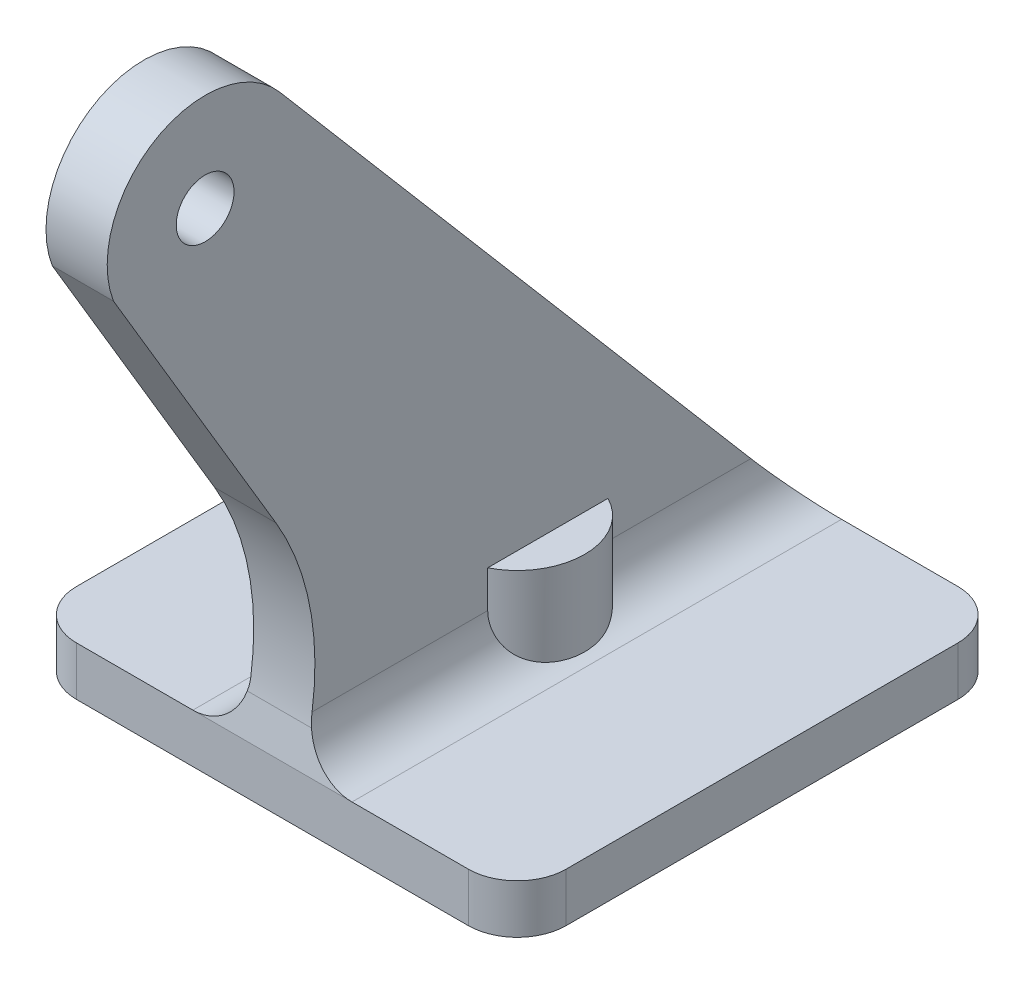
ISO-10303-21;
HEADER;
FILE_DESCRIPTION(('STEP AP214'),'2;1');
FILE_NAME('part.step','',(''),(''),'','','');
FILE_SCHEMA(('AUTOMOTIVE_DESIGN { 1 0 10303 214 1 1 1 1 }'));
ENDSEC;
DATA;
#1=APPLICATION_CONTEXT('core data for automotive mechanical design processes');
#2=APPLICATION_PROTOCOL_DEFINITION('international standard','automotive_design',2000,#1);
#3=PRODUCT_CONTEXT('',#1,'mechanical');
#4=PRODUCT('Part','Part','',(#3));
#5=PRODUCT_RELATED_PRODUCT_CATEGORY('part','',(#4));
#6=PRODUCT_DEFINITION_FORMATION('','',#4);
#7=PRODUCT_DEFINITION_CONTEXT('part definition',#1,'design');
#8=PRODUCT_DEFINITION('design','',#6,#7);
#9=PRODUCT_DEFINITION_SHAPE('','',#8);
#10=(LENGTH_UNIT() NAMED_UNIT(*) SI_UNIT(.MILLI.,.METRE.));
#11=(NAMED_UNIT(*) PLANE_ANGLE_UNIT() SI_UNIT($,.RADIAN.));
#12=(NAMED_UNIT(*) SI_UNIT($,.STERADIAN.) SOLID_ANGLE_UNIT());
#13=UNCERTAINTY_MEASURE_WITH_UNIT(LENGTH_MEASURE(1.E-05),#10,'distance_accuracy_value','');
#14=(GEOMETRIC_REPRESENTATION_CONTEXT(3) GLOBAL_UNCERTAINTY_ASSIGNED_CONTEXT((#13)) GLOBAL_UNIT_ASSIGNED_CONTEXT((#10,
#11,#12)) REPRESENTATION_CONTEXT('',''));
#15=CARTESIAN_POINT('',(0.,0.,0.));
#16=DIRECTION('',(0.,0.,1.));
#17=DIRECTION('',(1.,0.,0.));
#18=AXIS2_PLACEMENT_3D('',#15,#16,#17);
#19=CARTESIAN_POINT('',(0.,2.54,0.));
#20=DIRECTION('',(0.,1.,0.));
#21=DIRECTION('',(0.,0.,1.));
#22=AXIS2_PLACEMENT_3D('',#19,#20,#21);
#23=PLANE('',#22);
#24=DIRECTION('',(0.,0.,1.));
#25=VECTOR('',#24,1.);
#26=CARTESIAN_POINT('',(-12.7,2.54,-12.7));
#27=LINE('',#26,#25);
#28=CARTESIAN_POINT('',(-12.7,2.54,-10.16));
#29=VERTEX_POINT('',#28);
#30=CARTESIAN_POINT('',(-12.7,2.54,10.16));
#31=VERTEX_POINT('',#30);
#32=EDGE_CURVE('E233',#29,#31,#27,.T.);
#33=ORIENTED_EDGE('',*,*,#32,.T.);
#34=CARTESIAN_POINT('',(-10.16,2.54,10.16));
#35=DIRECTION('',(0.,1.,0.));
#36=DIRECTION('',(0.,0.,1.));
#37=AXIS2_PLACEMENT_3D('',#34,#35,#36);
#38=CIRCLE('',#37,2.54);
#39=CARTESIAN_POINT('',(-10.16,2.54,12.7));
#40=VERTEX_POINT('',#39);
#41=EDGE_CURVE('E338',#31,#40,#38,.T.);
#42=ORIENTED_EDGE('',*,*,#41,.T.);
#43=DIRECTION('',(1.,0.,0.));
#44=VECTOR('',#43,1.);
#45=CARTESIAN_POINT('',(-12.7,2.54,12.7));
#46=LINE('',#45,#44);
#47=CARTESIAN_POINT('',(-4.1275,2.54,12.7));
#48=VERTEX_POINT('',#47);
#49=EDGE_CURVE('E273',#40,#48,#46,.T.);
#50=ORIENTED_EDGE('',*,*,#49,.T.);
#51=DIRECTION('',(0.,0.,-1.));
#52=VECTOR('',#51,1.);
#53=CARTESIAN_POINT('',(-4.1275,2.54,-12.7));
#54=LINE('',#53,#52);
#55=CARTESIAN_POINT('',(-4.1275,2.54,-12.7));
#56=VERTEX_POINT('',#55);
#57=EDGE_CURVE('E275',#48,#56,#54,.T.);
#58=ORIENTED_EDGE('',*,*,#57,.T.);
#59=DIRECTION('',(-1.,0.,0.));
#60=VECTOR('',#59,1.);
#61=CARTESIAN_POINT('',(-12.7,2.54,-12.7));
#62=LINE('',#61,#60);
#63=CARTESIAN_POINT('',(-10.16,2.54,-12.7));
#64=VERTEX_POINT('',#63);
#65=EDGE_CURVE('E229',#56,#64,#62,.T.);
#66=ORIENTED_EDGE('',*,*,#65,.T.);
#67=CARTESIAN_POINT('',(-10.16,2.54,-10.16));
#68=DIRECTION('',(0.,1.,0.));
#69=DIRECTION('',(0.,0.,1.));
#70=AXIS2_PLACEMENT_3D('',#67,#68,#69);
#71=CIRCLE('',#70,2.54);
#72=EDGE_CURVE('E340',#64,#29,#71,.T.);
#73=ORIENTED_EDGE('',*,*,#72,.T.);
#74=EDGE_LOOP('',(#33,#42,#50,#58,#66,#73));
#75=FACE_BOUND('',#74,.T.);
#76=ADVANCED_FACE('F33',(#75),#23,.T.);
#77=CARTESIAN_POINT('',(12.7,2.54,-12.7));
#78=DIRECTION('',(-1.,0.,0.));
#79=DIRECTION('',(0.,0.,1.));
#80=AXIS2_PLACEMENT_3D('',#77,#78,#79);
#81=PLANE('',#80);
#82=DIRECTION('',(0.,0.,-1.));
#83=VECTOR('',#82,1.);
#84=CARTESIAN_POINT('',(12.7,0.,-12.7));
#85=LINE('',#84,#83);
#86=CARTESIAN_POINT('',(12.7,0.,10.16));
#87=VERTEX_POINT('',#86);
#88=CARTESIAN_POINT('',(12.7,0.,-10.16));
#89=VERTEX_POINT('',#88);
#90=EDGE_CURVE('E280',#87,#89,#85,.T.);
#91=ORIENTED_EDGE('',*,*,#90,.T.);
#92=DIRECTION('',(0.,-1.,0.));
#93=VECTOR('',#92,1.);
#94=CARTESIAN_POINT('',(12.7,2.54,-10.16));
#95=LINE('',#94,#93);
#96=CARTESIAN_POINT('',(12.7,2.54,-10.16));
#97=VERTEX_POINT('',#96);
#98=EDGE_CURVE('E266',#89,#97,#95,.F.);
#99=ORIENTED_EDGE('',*,*,#98,.T.);
#100=DIRECTION('',(0.,0.,-1.));
#101=VECTOR('',#100,1.);
#102=CARTESIAN_POINT('',(12.7,2.54,-12.7));
#103=LINE('',#102,#101);
#104=CARTESIAN_POINT('',(12.7,2.54,10.16));
#105=VERTEX_POINT('',#104);
#106=EDGE_CURVE('E226',#105,#97,#103,.T.);
#107=ORIENTED_EDGE('',*,*,#106,.F.);
#108=DIRECTION('',(0.,-1.,0.));
#109=VECTOR('',#108,1.);
#110=CARTESIAN_POINT('',(12.7,2.54,10.16));
#111=LINE('',#110,#109);
#112=EDGE_CURVE('E263',#105,#87,#111,.T.);
#113=ORIENTED_EDGE('',*,*,#112,.T.);
#114=EDGE_LOOP('',(#91,#99,#107,#113));
#115=FACE_BOUND('',#114,.T.);
#116=ADVANCED_FACE('F314',(#115),#81,.F.);
#117=CARTESIAN_POINT('',(-12.7,2.54,-12.7));
#118=DIRECTION('',(0.,0.,1.));
#119=DIRECTION('',(1.,0.,0.));
#120=AXIS2_PLACEMENT_3D('',#117,#118,#119);
#121=PLANE('',#120);
#122=CARTESIAN_POINT('',(10.16,2.54,-12.7));
#123=VERTEX_POINT('',#122);
#124=CARTESIAN_POINT('',(4.1275,2.54,-12.7));
#125=VERTEX_POINT('',#124);
#126=EDGE_CURVE('E240',#123,#125,#62,.T.);
#127=ORIENTED_EDGE('',*,*,#126,.F.);
#128=DIRECTION('',(0.,-1.,0.));
#129=VECTOR('',#128,1.);
#130=CARTESIAN_POINT('',(10.16,2.54,-12.7));
#131=LINE('',#130,#129);
#132=CARTESIAN_POINT('',(10.16,0.,-12.7));
#133=VERTEX_POINT('',#132);
#134=EDGE_CURVE('E252',#123,#133,#131,.T.);
#135=ORIENTED_EDGE('',*,*,#134,.T.);
#136=DIRECTION('',(-1.,0.,0.));
#137=VECTOR('',#136,1.);
#138=CARTESIAN_POINT('',(-12.7,0.,-12.7));
#139=LINE('',#138,#137);
#140=CARTESIAN_POINT('',(-10.16,0.,-12.7));
#141=VERTEX_POINT('',#140);
#142=EDGE_CURVE('E367',#133,#141,#139,.T.);
#143=ORIENTED_EDGE('',*,*,#142,.T.);
#144=DIRECTION('',(0.,-1.,0.));
#145=VECTOR('',#144,1.);
#146=CARTESIAN_POINT('',(-10.16,2.54,-12.7));
#147=LINE('',#146,#145);
#148=EDGE_CURVE('E250',#141,#64,#147,.F.);
#149=ORIENTED_EDGE('',*,*,#148,.T.);
#150=ORIENTED_EDGE('',*,*,#65,.F.);
#151=DIRECTION('',(-1.,0.,0.));
#152=VECTOR('',#151,1.);
#153=CARTESIAN_POINT('',(1.5875,2.54,-12.7));
#154=LINE('',#153,#152);
#155=EDGE_CURVE('E225',#125,#56,#154,.T.);
#156=ORIENTED_EDGE('',*,*,#155,.F.);
#157=EDGE_LOOP('',(#127,#135,#143,#149,#150,#156));
#158=FACE_BOUND('',#157,.T.);
#159=ADVANCED_FACE('F457',(#158),#121,.F.);
#160=CARTESIAN_POINT('',(-12.7,2.54,-12.7));
#161=DIRECTION('',(1.,0.,0.));
#162=DIRECTION('',(0.,0.,-1.));
#163=AXIS2_PLACEMENT_3D('',#160,#161,#162);
#164=PLANE('',#163);
#165=DIRECTION('',(0.,0.,1.));
#166=VECTOR('',#165,1.);
#167=CARTESIAN_POINT('',(-12.7,0.,-12.7));
#168=LINE('',#167,#166);
#169=CARTESIAN_POINT('',(-12.7,0.,-10.16));
#170=VERTEX_POINT('',#169);
#171=CARTESIAN_POINT('',(-12.7,0.,10.16));
#172=VERTEX_POINT('',#171);
#173=EDGE_CURVE('E365',#170,#172,#168,.T.);
#174=ORIENTED_EDGE('',*,*,#173,.T.);
#175=DIRECTION('',(0.,-1.,0.));
#176=VECTOR('',#175,1.);
#177=CARTESIAN_POINT('',(-12.7,2.54,10.16));
#178=LINE('',#177,#176);
#179=EDGE_CURVE('E342',#172,#31,#178,.F.);
#180=ORIENTED_EDGE('',*,*,#179,.T.);
#181=ORIENTED_EDGE('',*,*,#32,.F.);
#182=DIRECTION('',(0.,-1.,0.));
#183=VECTOR('',#182,1.);
#184=CARTESIAN_POINT('',(-12.7,2.54,-10.16));
#185=LINE('',#184,#183);
#186=EDGE_CURVE('E344',#29,#170,#185,.T.);
#187=ORIENTED_EDGE('',*,*,#186,.T.);
#188=EDGE_LOOP('',(#174,#180,#181,#187));
#189=FACE_BOUND('',#188,.T.);
#190=ADVANCED_FACE('F581',(#189),#164,.F.);
#191=CARTESIAN_POINT('',(-12.7,2.54,12.7));
#192=DIRECTION('',(0.,0.,-1.));
#193=DIRECTION('',(-1.,0.,0.));
#194=AXIS2_PLACEMENT_3D('',#191,#192,#193);
#195=PLANE('',#194);
#196=DIRECTION('',(1.,0.,0.));
#197=VECTOR('',#196,1.);
#198=CARTESIAN_POINT('',(-12.7,0.,12.7));
#199=LINE('',#198,#197);
#200=CARTESIAN_POINT('',(-10.16,0.,12.7));
#201=VERTEX_POINT('',#200);
#202=CARTESIAN_POINT('',(10.16,0.,12.7));
#203=VERTEX_POINT('',#202);
#204=EDGE_CURVE('E230',#201,#203,#199,.T.);
#205=ORIENTED_EDGE('',*,*,#204,.T.);
#206=DIRECTION('',(0.,-1.,0.));
#207=VECTOR('',#206,1.);
#208=CARTESIAN_POINT('',(10.16,2.54,12.7));
#209=LINE('',#208,#207);
#210=CARTESIAN_POINT('',(10.16,2.54,12.7));
#211=VERTEX_POINT('',#210);
#212=EDGE_CURVE('E346',#203,#211,#209,.F.);
#213=ORIENTED_EDGE('',*,*,#212,.T.);
#214=CARTESIAN_POINT('',(4.1275,2.54,12.7));
#215=VERTEX_POINT('',#214);
#216=EDGE_CURVE('E276',#215,#211,#46,.T.);
#217=ORIENTED_EDGE('',*,*,#216,.F.);
#218=DIRECTION('',(-1.,0.,0.));
#219=VECTOR('',#218,1.);
#220=CARTESIAN_POINT('',(1.5875,2.54,12.7));
#221=LINE('',#220,#219);
#222=EDGE_CURVE('E371',#215,#48,#221,.T.);
#223=ORIENTED_EDGE('',*,*,#222,.T.);
#224=ORIENTED_EDGE('',*,*,#49,.F.);
#225=DIRECTION('',(0.,-1.,0.));
#226=VECTOR('',#225,1.);
#227=CARTESIAN_POINT('',(-10.16,2.54,12.7));
#228=LINE('',#227,#226);
#229=EDGE_CURVE('E272',#40,#201,#228,.T.);
#230=ORIENTED_EDGE('',*,*,#229,.T.);
#231=EDGE_LOOP('',(#205,#213,#217,#223,#224,#230));
#232=FACE_BOUND('',#231,.T.);
#233=ADVANCED_FACE('F355',(#232),#195,.F.);
#234=ORIENTED_EDGE('',*,*,#106,.T.);
#235=CARTESIAN_POINT('',(10.16,2.54,-10.16));
#236=DIRECTION('',(0.,1.,0.));
#237=DIRECTION('',(0.,0.,1.));
#238=AXIS2_PLACEMENT_3D('',#235,#236,#237);
#239=CIRCLE('',#238,2.54);
#240=EDGE_CURVE('E270',#97,#123,#239,.T.);
#241=ORIENTED_EDGE('',*,*,#240,.T.);
#242=ORIENTED_EDGE('',*,*,#126,.T.);
#243=DIRECTION('',(0.,0.,-1.));
#244=VECTOR('',#243,1.);
#245=CARTESIAN_POINT('',(4.1275,2.54,0.));
#246=LINE('',#245,#244);
#247=EDGE_CURVE('E289',#125,#215,#246,.F.);
#248=ORIENTED_EDGE('',*,*,#247,.T.);
#249=ORIENTED_EDGE('',*,*,#216,.T.);
#250=CARTESIAN_POINT('',(10.16,2.54,10.16));
#251=DIRECTION('',(0.,1.,0.));
#252=DIRECTION('',(0.,0.,1.));
#253=AXIS2_PLACEMENT_3D('',#250,#251,#252);
#254=CIRCLE('',#253,2.54);
#255=EDGE_CURVE('E268',#211,#105,#254,.T.);
#256=ORIENTED_EDGE('',*,*,#255,.T.);
#257=EDGE_LOOP('',(#234,#241,#242,#248,#249,#256));
#258=FACE_BOUND('',#257,.T.);
#259=ADVANCED_FACE('F442',(#258),#23,.T.);
#260=CARTESIAN_POINT('',(0.,0.,0.));
#261=DIRECTION('',(0.,1.,0.));
#262=DIRECTION('',(0.,0.,1.));
#263=AXIS2_PLACEMENT_3D('',#260,#261,#262);
#264=PLANE('',#263);
#265=CARTESIAN_POINT('',(0.,0.,0.));
#266=DIRECTION('',(0.,-1.,0.));
#267=DIRECTION('',(0.,0.,-1.));
#268=AXIS2_PLACEMENT_3D('',#265,#266,#267);
#269=CIRCLE('',#268,1.25);
#270=CARTESIAN_POINT('',(0.,0.,-1.25));
#271=VERTEX_POINT('',#270);
#272=EDGE_CURVE('E433',#271,#271,#269,.T.);
#273=ORIENTED_EDGE('',*,*,#272,.F.);
#274=EDGE_LOOP('',(#273));
#275=FACE_BOUND('',#274,.T.);
#276=ORIENTED_EDGE('',*,*,#142,.F.);
#277=CARTESIAN_POINT('',(10.16,0.,-10.16));
#278=DIRECTION('',(0.,1.,0.));
#279=DIRECTION('',(0.,0.,1.));
#280=AXIS2_PLACEMENT_3D('',#277,#278,#279);
#281=CIRCLE('',#280,2.54);
#282=EDGE_CURVE('E261',#133,#89,#281,.F.);
#283=ORIENTED_EDGE('',*,*,#282,.T.);
#284=ORIENTED_EDGE('',*,*,#90,.F.);
#285=CARTESIAN_POINT('',(10.16,0.,10.16));
#286=DIRECTION('',(0.,1.,0.));
#287=DIRECTION('',(0.,0.,1.));
#288=AXIS2_PLACEMENT_3D('',#285,#286,#287);
#289=CIRCLE('',#288,2.54);
#290=EDGE_CURVE('E259',#87,#203,#289,.F.);
#291=ORIENTED_EDGE('',*,*,#290,.T.);
#292=ORIENTED_EDGE('',*,*,#204,.F.);
#293=CARTESIAN_POINT('',(-10.16,0.,10.16));
#294=DIRECTION('',(0.,1.,0.));
#295=DIRECTION('',(0.,0.,1.));
#296=AXIS2_PLACEMENT_3D('',#293,#294,#295);
#297=CIRCLE('',#296,2.54);
#298=EDGE_CURVE('E257',#201,#172,#297,.F.);
#299=ORIENTED_EDGE('',*,*,#298,.T.);
#300=ORIENTED_EDGE('',*,*,#173,.F.);
#301=CARTESIAN_POINT('',(-10.16,0.,-10.16));
#302=DIRECTION('',(0.,1.,0.));
#303=DIRECTION('',(0.,0.,1.));
#304=AXIS2_PLACEMENT_3D('',#301,#302,#303);
#305=CIRCLE('',#304,2.54);
#306=EDGE_CURVE('E255',#170,#141,#305,.F.);
#307=ORIENTED_EDGE('',*,*,#306,.T.);
#308=EDGE_LOOP('',(#276,#283,#284,#291,#292,#299,#300,#307));
#309=FACE_BOUND('',#308,.T.);
#310=ADVANCED_FACE('F361',(#275,#309),#264,.F.);
#311=CARTESIAN_POINT('',(1.5875,30.48,17.78));
#312=DIRECTION('',(-1.,0.,0.));
#313=DIRECTION('',(0.,0.,1.));
#314=AXIS2_PLACEMENT_3D('',#311,#312,#313);
#315=PLANE('',#314);
#316=DIRECTION('',(0.,0.,1.));
#317=VECTOR('',#316,1.);
#318=CARTESIAN_POINT('',(1.5875,7.,17.78));
#319=LINE('',#318,#317);
#320=CARTESIAN_POINT('',(1.5875,7.,-3.11926974627075));
#321=VERTEX_POINT('',#320);
#322=CARTESIAN_POINT('',(1.5875,7.,3.11926974627075));
#323=VERTEX_POINT('',#322);
#324=EDGE_CURVE('E181',#321,#323,#319,.T.);
#325=ORIENTED_EDGE('',*,*,#324,.F.);
#326=DIRECTION('',(0.,-1.,0.));
#327=VECTOR('',#326,1.);
#328=CARTESIAN_POINT('',(1.5875,7.,-3.11926974627075));
#329=LINE('',#328,#327);
#330=CARTESIAN_POINT('',(1.5875,5.08,-3.11926974627075));
#331=VERTEX_POINT('',#330);
#332=EDGE_CURVE('E170',#321,#331,#329,.T.);
#333=ORIENTED_EDGE('',*,*,#332,.T.);
#334=DIRECTION('',(0.,0.,-1.));
#335=VECTOR('',#334,1.);
#336=CARTESIAN_POINT('',(1.5875,5.08,17.78));
#337=LINE('',#336,#335);
#338=CARTESIAN_POINT('',(1.5875,5.08,-10.5358112107755));
#339=VERTEX_POINT('',#338);
#340=EDGE_CURVE('E381',#331,#339,#337,.T.);
#341=ORIENTED_EDGE('',*,*,#340,.T.);
#342=DIRECTION('',(0.,0.761171466548825,0.648550690780537));
#343=VECTOR('',#342,1.);
#344=CARTESIAN_POINT('',(1.5875,33.7746375091651,13.913248949932));
#345=LINE('',#344,#343);
#346=CARTESIAN_POINT('',(1.5875,33.7746375091651,13.913248949932));
#347=VERTEX_POINT('',#346);
#348=EDGE_CURVE('E202',#339,#347,#345,.T.);
#349=ORIENTED_EDGE('',*,*,#348,.T.);
#350=CARTESIAN_POINT('',(1.5875,30.48,17.78));
#351=DIRECTION('',(1.,0.,0.));
#352=DIRECTION('',(0.,0.,1.));
#353=AXIS2_PLACEMENT_3D('',#350,#351,#352);
#354=CIRCLE('',#353,5.08);
#355=CARTESIAN_POINT('',(1.5875,28.69184,22.53488));
#356=VERTEX_POINT('',#355);
#357=EDGE_CURVE('E199',#347,#356,#354,.T.);
#358=ORIENTED_EDGE('',*,*,#357,.T.);
#359=DIRECTION('',(0.,-0.859584182020622,-0.51099416241278));
#360=VECTOR('',#359,1.);
#361=CARTESIAN_POINT('',(1.5875,28.69184,22.53488));
#362=LINE('',#361,#360);
#363=CARTESIAN_POINT('',(1.5875,14.5181231114303,14.1090774535581));
#364=VERTEX_POINT('',#363);
#365=EDGE_CURVE('E201',#356,#364,#362,.T.);
#366=ORIENTED_EDGE('',*,*,#365,.T.);
#367=CARTESIAN_POINT('',(1.5875,7.14487447065606,26.5122091679961));
#368=DIRECTION('',(-1.,0.,0.));
#369=DIRECTION('',(0.,0.,1.));
#370=AXIS2_PLACEMENT_3D('',#367,#368,#369);
#371=CIRCLE('',#370,14.4292228427028);
#372=CARTESIAN_POINT('',(1.5875,5.08,12.2314961163026));
#373=VERTEX_POINT('',#372);
#374=EDGE_CURVE('E204',#364,#373,#371,.T.);
#375=ORIENTED_EDGE('',*,*,#374,.T.);
#376=CARTESIAN_POINT('',(1.5875,5.08,3.11926974627075));
#377=VERTEX_POINT('',#376);
#378=EDGE_CURVE('E287',#373,#377,#337,.T.);
#379=ORIENTED_EDGE('',*,*,#378,.T.);
#380=DIRECTION('',(0.,-1.,0.));
#381=VECTOR('',#380,1.);
#382=CARTESIAN_POINT('',(1.5875,7.,3.11926974627075));
#383=LINE('',#382,#381);
#384=EDGE_CURVE('E56',#377,#323,#383,.F.);
#385=ORIENTED_EDGE('',*,*,#384,.T.);
#386=EDGE_LOOP('',(#325,#333,#341,#349,#358,#366,#375,#379,#385));
#387=FACE_BOUND('',#386,.T.);
#388=CARTESIAN_POINT('',(1.5875,30.48,17.78));
#389=DIRECTION('',(1.,0.,0.));
#390=DIRECTION('',(0.,0.,-1.));
#391=AXIS2_PLACEMENT_3D('',#388,#389,#390);
#392=CIRCLE('',#391,1.5);
#393=CARTESIAN_POINT('',(1.5875,30.48,16.28));
#394=VERTEX_POINT('',#393);
#395=EDGE_CURVE('E190',#394,#394,#392,.T.);
#396=ORIENTED_EDGE('',*,*,#395,.F.);
#397=EDGE_LOOP('',(#396));
#398=FACE_BOUND('',#397,.T.);
#399=ADVANCED_FACE('F184',(#387,#398),#315,.F.);
#400=CARTESIAN_POINT('',(-1.5875,30.48,17.78));
#401=DIRECTION('',(-1.,0.,0.));
#402=DIRECTION('',(0.,0.,1.));
#403=AXIS2_PLACEMENT_3D('',#400,#401,#402);
#404=PLANE('',#403);
#405=DIRECTION('',(0.,-1.,0.));
#406=VECTOR('',#405,1.);
#407=CARTESIAN_POINT('',(-1.5875,7.,-3.11926974627075));
#408=LINE('',#407,#406);
#409=CARTESIAN_POINT('',(-1.5875,7.,-3.11926974627075));
#410=VERTEX_POINT('',#409);
#411=CARTESIAN_POINT('',(-1.5875,5.08,-3.11926974627075));
#412=VERTEX_POINT('',#411);
#413=EDGE_CURVE('E48',#410,#412,#408,.T.);
#414=ORIENTED_EDGE('',*,*,#413,.F.);
#415=DIRECTION('',(0.,0.,1.));
#416=VECTOR('',#415,1.);
#417=CARTESIAN_POINT('',(-1.5875,7.,17.78));
#418=LINE('',#417,#416);
#419=CARTESIAN_POINT('',(-1.5875,7.,3.11926974627075));
#420=VERTEX_POINT('',#419);
#421=EDGE_CURVE('E11',#410,#420,#418,.T.);
#422=ORIENTED_EDGE('',*,*,#421,.T.);
#423=DIRECTION('',(0.,-1.,0.));
#424=VECTOR('',#423,1.);
#425=CARTESIAN_POINT('',(-1.5875,7.,3.11926974627075));
#426=LINE('',#425,#424);
#427=CARTESIAN_POINT('',(-1.5875,5.08,3.11926974627075));
#428=VERTEX_POINT('',#427);
#429=EDGE_CURVE('E192',#428,#420,#426,.F.);
#430=ORIENTED_EDGE('',*,*,#429,.F.);
#431=DIRECTION('',(0.,0.,-1.));
#432=VECTOR('',#431,1.);
#433=CARTESIAN_POINT('',(-1.5875,5.08,12.7));
#434=LINE('',#433,#432);
#435=CARTESIAN_POINT('',(-1.5875,5.08,12.2314961163026));
#436=VERTEX_POINT('',#435);
#437=EDGE_CURVE('E382',#428,#436,#434,.F.);
#438=ORIENTED_EDGE('',*,*,#437,.T.);
#439=CARTESIAN_POINT('',(-1.5875,7.14487447065606,26.5122091679961));
#440=DIRECTION('',(-1.,0.,0.));
#441=DIRECTION('',(0.,0.,1.));
#442=AXIS2_PLACEMENT_3D('',#439,#440,#441);
#443=CIRCLE('',#442,14.4292228427028);
#444=CARTESIAN_POINT('',(-1.5875,14.5181231114303,14.1090774535581));
#445=VERTEX_POINT('',#444);
#446=EDGE_CURVE('E212',#445,#436,#443,.T.);
#447=ORIENTED_EDGE('',*,*,#446,.F.);
#448=DIRECTION('',(0.,-0.859584182020622,-0.51099416241278));
#449=VECTOR('',#448,1.);
#450=CARTESIAN_POINT('',(-1.5875,28.69184,22.53488));
#451=LINE('',#450,#449);
#452=CARTESIAN_POINT('',(-1.5875,28.69184,22.53488));
#453=VERTEX_POINT('',#452);
#454=EDGE_CURVE('E210',#453,#445,#451,.T.);
#455=ORIENTED_EDGE('',*,*,#454,.F.);
#456=CARTESIAN_POINT('',(-1.5875,30.48,17.78));
#457=DIRECTION('',(1.,0.,0.));
#458=DIRECTION('',(0.,0.,1.));
#459=AXIS2_PLACEMENT_3D('',#456,#457,#458);
#460=CIRCLE('',#459,5.08);
#461=CARTESIAN_POINT('',(-1.5875,33.7746375091651,13.913248949932));
#462=VERTEX_POINT('',#461);
#463=EDGE_CURVE('E208',#462,#453,#460,.T.);
#464=ORIENTED_EDGE('',*,*,#463,.F.);
#465=DIRECTION('',(0.,0.761171466548825,0.648550690780537));
#466=VECTOR('',#465,1.);
#467=CARTESIAN_POINT('',(-1.5875,33.7746375091651,13.913248949932));
#468=LINE('',#467,#466);
#469=CARTESIAN_POINT('',(-1.5875,5.08,-10.5358112107755));
#470=VERTEX_POINT('',#469);
#471=EDGE_CURVE('E197',#470,#462,#468,.T.);
#472=ORIENTED_EDGE('',*,*,#471,.F.);
#473=EDGE_CURVE('E378',#470,#412,#434,.F.);
#474=ORIENTED_EDGE('',*,*,#473,.T.);
#475=EDGE_LOOP('',(#414,#422,#430,#438,#447,#455,#464,#472,#474));
#476=FACE_BOUND('',#475,.T.);
#477=CARTESIAN_POINT('',(-1.5875,30.48,17.78));
#478=DIRECTION('',(1.,0.,0.));
#479=DIRECTION('',(0.,0.,-1.));
#480=AXIS2_PLACEMENT_3D('',#477,#478,#479);
#481=CIRCLE('',#480,1.5);
#482=CARTESIAN_POINT('',(-1.5875,30.48,16.28));
#483=VERTEX_POINT('',#482);
#484=EDGE_CURVE('E187',#483,#483,#481,.T.);
#485=ORIENTED_EDGE('',*,*,#484,.T.);
#486=EDGE_LOOP('',(#485));
#487=FACE_BOUND('',#486,.T.);
#488=ADVANCED_FACE('F394',(#476,#487),#404,.T.);
#489=CARTESIAN_POINT('',(1.5875,4.44988851549806,12.336895325055));
#490=DIRECTION('',(0.,-0.186772772486561,-0.982403141005607));
#491=DIRECTION('',(0.,0.982403141005607,-0.186772772486561));
#492=AXIS2_PLACEMENT_3D('',#489,#490,#491);
#493=PLANE('',#492);
#494=DIRECTION('',(-1.,0.,0.));
#495=VECTOR('',#494,1.);
#496=CARTESIAN_POINT('',(1.5875,4.44988851549807,12.336895325055));
#497=LINE('',#496,#495);
#498=CARTESIAN_POINT('',(1.66689854566027,4.44988851549807,12.336895325055));
#499=VERTEX_POINT('',#498);
#500=CARTESIAN_POINT('',(-1.66689854566027,4.44988851549807,12.336895325055));
#501=VERTEX_POINT('',#500);
#502=EDGE_CURVE('E207',#499,#501,#497,.T.);
#503=ORIENTED_EDGE('',*,*,#502,.T.);
#504=CARTESIAN_POINT('',(-4.1275,5.08,12.217099628132));
#505=DIRECTION('',(0.,-0.186772772486561,-0.982403141005607));
#506=DIRECTION('',(0.,-0.982403141005607,0.186772772486561));
#507=AXIS2_PLACEMENT_3D('',#504,#505,#506);
#508=ELLIPSE('',#507,2.58549661944281,2.54);
#509=EDGE_CURVE('E301',#501,#48,#508,.T.);
#510=ORIENTED_EDGE('',*,*,#509,.T.);
#511=ORIENTED_EDGE('',*,*,#222,.F.);
#512=CARTESIAN_POINT('',(4.1275,5.08,12.217099628132));
#513=DIRECTION('',(0.,-0.186772772486561,-0.982403141005607));
#514=DIRECTION('',(0.,0.982403141005607,-0.186772772486561));
#515=AXIS2_PLACEMENT_3D('',#512,#513,#514);
#516=ELLIPSE('',#515,2.58549661944281,2.54);
#517=EDGE_CURVE('E407',#215,#499,#516,.T.);
#518=ORIENTED_EDGE('',*,*,#517,.T.);
#519=EDGE_LOOP('',(#503,#510,#511,#518));
#520=FACE_BOUND('',#519,.T.);
#521=ADVANCED_FACE('F461',(#520),#493,.F.);
#522=CARTESIAN_POINT('',(1.5875,33.7746375091651,13.913248949932));
#523=DIRECTION('',(0.,-0.648550690780537,0.761171466548825));
#524=DIRECTION('',(0.,-0.761171466548825,-0.648550690780537));
#525=AXIS2_PLACEMENT_3D('',#522,#523,#524);
#526=PLANE('',#525);
#527=ORIENTED_EDGE('',*,*,#155,.T.);
#528=CARTESIAN_POINT('',(-4.1275,5.08,-10.5358112107755));
#529=DIRECTION('',(0.,-0.648550690780537,0.761171466548825));
#530=DIRECTION('',(0.,0.761171466548825,0.648550690780537));
#531=AXIS2_PLACEMENT_3D('',#528,#529,#530);
#532=ELLIPSE('',#531,3.33696165926508,2.54);
#533=EDGE_CURVE('E292',#56,#470,#532,.T.);
#534=ORIENTED_EDGE('',*,*,#533,.T.);
#535=ORIENTED_EDGE('',*,*,#471,.T.);
#536=DIRECTION('',(-1.,0.,0.));
#537=VECTOR('',#536,1.);
#538=CARTESIAN_POINT('',(1.5875,33.7746375091651,13.913248949932));
#539=LINE('',#538,#537);
#540=EDGE_CURVE('E222',#347,#462,#539,.T.);
#541=ORIENTED_EDGE('',*,*,#540,.F.);
#542=ORIENTED_EDGE('',*,*,#348,.F.);
#543=CARTESIAN_POINT('',(4.1275,5.08,-10.5358112107755));
#544=DIRECTION('',(0.,-0.648550690780537,0.761171466548825));
#545=DIRECTION('',(0.,-0.761171466548825,-0.648550690780537));
#546=AXIS2_PLACEMENT_3D('',#543,#544,#545);
#547=ELLIPSE('',#546,3.33696165926508,2.54);
#548=EDGE_CURVE('E405',#339,#125,#547,.T.);
#549=ORIENTED_EDGE('',*,*,#548,.T.);
#550=EDGE_LOOP('',(#527,#534,#535,#541,#542,#549));
#551=FACE_BOUND('',#550,.T.);
#552=ADVANCED_FACE('F419',(#551),#526,.F.);
#553=CARTESIAN_POINT('',(1.5875,30.48,17.78));
#554=DIRECTION('',(-1.,0.,0.));
#555=DIRECTION('',(0.,0.,1.));
#556=AXIS2_PLACEMENT_3D('',#553,#554,#555);
#557=CYLINDRICAL_SURFACE('',#556,5.08);
#558=ORIENTED_EDGE('',*,*,#463,.T.);
#559=DIRECTION('',(-1.,0.,0.));
#560=VECTOR('',#559,1.);
#561=CARTESIAN_POINT('',(1.5875,28.69184,22.53488));
#562=LINE('',#561,#560);
#563=EDGE_CURVE('E219',#356,#453,#562,.T.);
#564=ORIENTED_EDGE('',*,*,#563,.F.);
#565=ORIENTED_EDGE('',*,*,#357,.F.);
#566=ORIENTED_EDGE('',*,*,#540,.T.);
#567=EDGE_LOOP('',(#558,#564,#565,#566));
#568=FACE_BOUND('',#567,.T.);
#569=ADVANCED_FACE('F425',(#568),#557,.T.);
#570=CARTESIAN_POINT('',(1.5875,28.69184,22.53488));
#571=DIRECTION('',(0.,0.51099416241278,-0.859584182020622));
#572=DIRECTION('',(0.,0.859584182020622,0.51099416241278));
#573=AXIS2_PLACEMENT_3D('',#570,#571,#572);
#574=PLANE('',#573);
#575=ORIENTED_EDGE('',*,*,#454,.T.);
#576=DIRECTION('',(-1.,0.,0.));
#577=VECTOR('',#576,1.);
#578=CARTESIAN_POINT('',(1.5875,14.5181231114303,14.1090774535581));
#579=LINE('',#578,#577);
#580=EDGE_CURVE('E216',#364,#445,#579,.T.);
#581=ORIENTED_EDGE('',*,*,#580,.F.);
#582=ORIENTED_EDGE('',*,*,#365,.F.);
#583=ORIENTED_EDGE('',*,*,#563,.T.);
#584=EDGE_LOOP('',(#575,#581,#582,#583));
#585=FACE_BOUND('',#584,.T.);
#586=ADVANCED_FACE('F427',(#585),#574,.F.);
#587=CARTESIAN_POINT('',(1.5875,7.14487447065606,26.5122091679961));
#588=DIRECTION('',(-1.,0.,0.));
#589=DIRECTION('',(0.,0.,1.));
#590=AXIS2_PLACEMENT_3D('',#587,#588,#589);
#591=CYLINDRICAL_SURFACE('',#590,14.4292228427028);
#592=ORIENTED_EDGE('',*,*,#446,.T.);
#593=CARTESIAN_POINT('',(-1.5875,5.08,12.2314961163026));
#594=CARTESIAN_POINT('',(-1.58749782736951,5.02665942602359,12.2392071686188));
#595=CARTESIAN_POINT('',(-1.58918021097926,4.97336392422784,12.2472199178251));
#596=CARTESIAN_POINT('',(-1.59586806476446,4.86727800266273,12.2637746622777));
#597=CARTESIAN_POINT('',(-1.60086054865407,4.81448642368039,12.2723144714735));
#598=CARTESIAN_POINT('',(-1.61412305476183,4.70940452736651,12.2899099049145));
#599=CARTESIAN_POINT('',(-1.62239304297533,4.65711420484011,12.2989655238073));
#600=CARTESIAN_POINT('',(-1.64219935092227,4.55302686530006,12.317575887397));
#601=CARTESIAN_POINT('',(-1.65374833306063,4.50123258145838,12.327132447571));
#602=CARTESIAN_POINT('',(-1.66689854566028,4.44988851549807,12.336895325055));
#603=B_SPLINE_CURVE_WITH_KNOTS('',3,(#593,#594,#595,#596,#597,#598,#599,#600,#601,#602),
.UNSPECIFIED.,.F.,.F.,(4,2,2,2,4),(0.,0.161655945449187,0.322681400769945,0.483705185467956,
0.645359452367066),.UNSPECIFIED.);
#604=EDGE_CURVE('E294',#436,#501,#603,.T.);
#605=ORIENTED_EDGE('',*,*,#604,.T.);
#606=ORIENTED_EDGE('',*,*,#502,.F.);
#607=CARTESIAN_POINT('',(1.66689854566027,4.44988851549807,12.336895325055));
#608=CARTESIAN_POINT('',(1.65374833306063,4.50123258145838,12.327132447571));
#609=CARTESIAN_POINT('',(1.64219935092227,4.55302686530006,12.317575887397));
#610=CARTESIAN_POINT('',(1.62239304297533,4.65711420484011,12.2989655238073));
#611=CARTESIAN_POINT('',(1.61412305476183,4.70940452736651,12.2899099049145));
#612=CARTESIAN_POINT('',(1.60086054865407,4.8144864236804,12.2723144714735));
#613=CARTESIAN_POINT('',(1.59586806476446,4.86727800266273,12.2637746622777));
#614=CARTESIAN_POINT('',(1.58918021097926,4.97336392422784,12.2472199178251));
#615=CARTESIAN_POINT('',(1.58749782736951,5.02665942602359,12.2392071686188));
#616=CARTESIAN_POINT('',(1.5875,5.08,12.2314961163026));
#617=B_SPLINE_CURVE_WITH_KNOTS('',3,(#607,#608,#609,#610,#611,#612,#613,#614,#615,#616),
.UNSPECIFIED.,.F.,.F.,(4,2,2,2,4),(0.,0.16165426689911,0.322678051597122,0.483703506917879,
0.645359452367067),.UNSPECIFIED.);
#618=EDGE_CURVE('E243',#499,#373,#617,.T.);
#619=ORIENTED_EDGE('',*,*,#618,.T.);
#620=ORIENTED_EDGE('',*,*,#374,.F.);
#621=ORIENTED_EDGE('',*,*,#580,.T.);
#622=EDGE_LOOP('',(#592,#605,#606,#619,#620,#621));
#623=FACE_BOUND('',#622,.T.);
#624=ADVANCED_FACE('F303',(#623),#591,.F.);
#625=CARTESIAN_POINT('',(1.5875,30.48,17.78));
#626=DIRECTION('',(-1.,0.,0.));
#627=DIRECTION('',(0.,0.,1.));
#628=AXIS2_PLACEMENT_3D('',#625,#626,#627);
#629=CYLINDRICAL_SURFACE('',#628,1.5);
#630=ORIENTED_EDGE('',*,*,#395,.T.);
#631=EDGE_LOOP('',(#630));
#632=FACE_BOUND('',#631,.T.);
#633=ORIENTED_EDGE('',*,*,#484,.F.);
#634=EDGE_LOOP('',(#633));
#635=FACE_BOUND('',#634,.T.);
#636=ADVANCED_FACE('F312',(#632,#635),#629,.F.);
#637=CARTESIAN_POINT('',(-4.1275,5.08,0.));
#638=DIRECTION('',(0.,0.,1.));
#639=DIRECTION('',(1.,0.,0.));
#640=AXIS2_PLACEMENT_3D('',#637,#638,#639);
#641=CYLINDRICAL_SURFACE('',#640,2.54);
#642=ORIENTED_EDGE('',*,*,#437,.F.);
#643=CARTESIAN_POINT('',(-1.5875,5.08,3.11926974627075));
#644=CARTESIAN_POINT('',(-1.58749130295176,5.01736668413084,3.11926049837121));
#645=CARTESIAN_POINT('',(-1.58981661420731,4.95473493917004,3.11809037242015));
#646=CARTESIAN_POINT('',(-1.59907041642084,4.8298993987988,3.11336206776922));
#647=CARTESIAN_POINT('',(-1.60599918852644,4.76769562976062,3.10980374321452));
#648=CARTESIAN_POINT('',(-1.62440057102408,4.64411159740414,3.10022986275654));
#649=CARTESIAN_POINT('',(-1.63587590106215,4.58273184975838,3.09421283604672));
#650=CARTESIAN_POINT('',(-1.66321898462416,4.46129122512764,3.07960064803179));
#651=CARTESIAN_POINT('',(-1.67908657784612,4.40123030009664,3.07100558081504));
#652=CARTESIAN_POINT('',(-1.73306407566222,4.22351880779128,3.04108763402719));
#653=CARTESIAN_POINT('',(-1.77754145336722,4.10838722256027,3.0156354156591));
#654=CARTESIAN_POINT('',(-1.88091555632776,3.88869980604625,2.95225301952663));
#655=CARTESIAN_POINT('',(-1.93979760774557,3.78413336441701,2.91433552653086));
#656=CARTESIAN_POINT('',(-2.06700878364945,3.59032240457973,2.82548206415654));
#657=CARTESIAN_POINT('',(-2.13512820143955,3.50081591440607,2.77481819632007));
#658=CARTESIAN_POINT('',(-2.27711441950248,3.33659236702856,2.65952767500561));
#659=CARTESIAN_POINT('',(-2.35098174713585,3.26187666908774,2.59489973938036));
#660=CARTESIAN_POINT('',(-2.49895950064606,3.12824599753879,2.45268093124901));
#661=CARTESIAN_POINT('',(-2.57306430898992,3.06922070519581,2.37518714500315));
#662=CARTESIAN_POINT('',(-2.71764848302851,2.96532157916485,2.20830040946982));
#663=CARTESIAN_POINT('',(-2.78812646505383,2.92045311343335,2.11890296480437));
#664=CARTESIAN_POINT('',(-2.92851785741385,2.83918205603457,1.92091179237539));
#665=CARTESIAN_POINT('',(-2.99770657804056,2.80403101201854,1.81129630310908));
#666=CARTESIAN_POINT('',(-3.12447210360053,2.74538624457885,1.58265835832697));
#667=CARTESIAN_POINT('',(-3.18204137832806,2.72190006648803,1.46362987162785));
#668=CARTESIAN_POINT('',(-3.2932070518091,2.68005454268769,1.19565057618946));
#669=CARTESIAN_POINT('',(-3.34403503509768,2.66348193580928,1.04527368637901));
#670=CARTESIAN_POINT('',(-3.42492847805931,2.63873095686217,0.738299407566996));
#671=CARTESIAN_POINT('',(-3.45498159361423,2.63055757408693,0.581698378607255));
#672=CARTESIAN_POINT('',(-3.48532654037933,2.62249825181409,0.332995088891299));
#673=CARTESIAN_POINT('',(-3.49283886675568,2.62056637295201,0.241771688979668));
#674=CARTESIAN_POINT('',(-3.50069771870168,2.61854853843117,0.0589707694962317));
#675=CARTESIAN_POINT('',(-3.50104353930157,2.61846276437385,-0.0326067840274571));
#676=CARTESIAN_POINT('',(-3.4945561790974,2.620123726519,-0.215555640136683));
#677=CARTESIAN_POINT('',(-3.48771761021097,2.62187183808073,-0.306926736347559));
#678=CARTESIAN_POINT('',(-3.46690891762924,2.62738190163481,-0.488792974533043));
#679=CARTESIAN_POINT('',(-3.45293886740737,2.63114383287942,-0.579288125522454));
#680=CARTESIAN_POINT('',(-3.41728643924519,2.64123919867193,-0.762359142768011));
#681=CARTESIAN_POINT('',(-3.39531929115652,2.64766900231624,-0.854874513421482));
#682=CARTESIAN_POINT('',(-3.34401533936926,2.66370660640335,-1.03757594499355));
#683=CARTESIAN_POINT('',(-3.31467763795736,2.67331479400984,-1.12776172069714));
#684=CARTESIAN_POINT('',(-3.24901637024995,2.69649898369084,-1.30491601775254));
#685=CARTESIAN_POINT('',(-3.2127008606464,2.71007041903889,-1.39188811291131));
#686=CARTESIAN_POINT('',(-3.13358144247665,2.74214913181836,-1.56187236072039));
#687=CARTESIAN_POINT('',(-3.09077983999477,2.7606546567382,-1.6448859070682));
#688=CARTESIAN_POINT('',(-3.01118927933463,2.79814678021124,-1.78535233596516));
#689=CARTESIAN_POINT('',(-2.9756795913402,2.81578902379416,-1.84389400387094));
#690=CARTESIAN_POINT('',(-2.9019279398508,2.85484520240551,-1.95791210784235));
#691=CARTESIAN_POINT('',(-2.86368662504936,2.87625824372131,-2.0133892661402));
#692=CARTESIAN_POINT('',(-2.78502044667414,2.92327880222279,-2.12087105694038));
#693=CARTESIAN_POINT('',(-2.74459673947044,2.94888411241793,-2.17287749640909));
#694=CARTESIAN_POINT('',(-2.66222238180604,3.00466064764753,-2.27305401360105));
#695=CARTESIAN_POINT('',(-2.6202725154934,3.03482955236168,-2.32122602201894));
#696=CARTESIAN_POINT('',(-2.53525264495821,3.10029083704141,-2.41380941349926));
#697=CARTESIAN_POINT('',(-2.49217631200374,3.13562282149908,-2.45818709287421));
#698=CARTESIAN_POINT('',(-2.40614422035553,3.21135961304152,-2.54245846183268));
#699=CARTESIAN_POINT('',(-2.36318841418937,3.25176200777072,-2.58235426676925));
#700=CARTESIAN_POINT('',(-2.27832498884062,3.33764775886276,-2.657526774764));
#701=CARTESIAN_POINT('',(-2.2364172502039,3.38313053292635,-2.6928040061858));
#702=CARTESIAN_POINT('',(-2.15460884455836,3.47897534235255,-2.7586994411616));
#703=CARTESIAN_POINT('',(-2.11470794918035,3.52933682062478,-2.78931817563695));
#704=CARTESIAN_POINT('',(-2.00885722544126,3.67431374564581,-2.8673148089173));
#705=CARTESIAN_POINT('',(-1.94587715000976,3.77373371918542,-2.9099853826078));
#706=CARTESIAN_POINT('',(-1.8329975555981,3.98403765305212,-2.98239155847113));
#707=CARTESIAN_POINT('',(-1.78310462455115,4.09492734810768,-3.01212065098347));
#708=CARTESIAN_POINT('',(-1.70012433016878,4.32248641992718,-3.05970913380741));
#709=CARTESIAN_POINT('',(-1.66671241415743,4.43899000731072,-3.07780008535378));
#710=CARTESIAN_POINT('',(-1.6168306424996,4.67649289146979,-3.10429866372924));
#711=CARTESIAN_POINT('',(-1.6003310324829,4.79748390329751,-3.11272329995086));
#712=CARTESIAN_POINT('',(-1.59090356771737,4.94581209288313,-3.11753472380397));
#713=CARTESIAN_POINT('',(-1.58962673277364,4.97264884231478,-3.11818618472284));
#714=CARTESIAN_POINT('',(-1.58792614480171,5.02632094768008,-3.11905340543437));
#715=CARTESIAN_POINT('',(-1.58750126807172,5.05315625870438,-3.11926973914509));
#716=CARTESIAN_POINT('',(-1.5875,5.08,-3.11926974627075));
#717=B_SPLINE_CURVE_WITH_KNOTS('',3,(#643,#644,#645,#646,#647,#648,#649,#650,#651,#652,#653,
#654,#655,#656,#657,#658,#659,#660,#661,#662,#663,#664,#665,#666,#667,#668,#669,#670,#671,#672,
#673,#674,#675,#676,#677,#678,#679,#680,#681,#682,#683,#684,#685,#686,#687,#688,#689,#690,#691,
#692,#693,#694,#695,#696,#697,#698,#699,#700,#701,#702,#703,#704,#705,#706,#707,#708,#709,#710,
#711,#712,#713,#714,#715,#716),.UNSPECIFIED.,.F.,.F.,(4,2,2,2,2,2,2,2,2,2,2,2,2,2,2,2,2,2,2,2,2,
2,2,2,2,2,2,2,2,2,2,2,2,2,2,2,4),(0.,0.187842742928421,0.375696959049494,0.563663715291874,
0.751623612319894,1.12768667635652,1.50336823392524,1.8716249969827,2.23991558687337,
2.60554380847901,2.97131050209537,3.37273082329889,3.77441046321788,4.25139845744003,
4.72866962779846,5.00306733049744,5.27749202559204,5.55212267821796,5.82675050146718,
6.11230637442813,6.39789704419203,6.68315992653181,6.96832162261192,7.18024107455889,
7.39211036714329,7.60386847915797,7.81551928424204,8.02888828467007,8.24215615239574,
8.45539960097358,8.66861872830652,9.04214369212066,9.41585632525242,9.78188237119391,
10.1472633445313,10.2278798605226,10.3083899761464),.UNSPECIFIED.);
#718=EDGE_CURVE('E177',#428,#412,#717,.T.);
#719=ORIENTED_EDGE('',*,*,#718,.T.);
#720=ORIENTED_EDGE('',*,*,#473,.F.);
#721=ORIENTED_EDGE('',*,*,#533,.F.);
#722=ORIENTED_EDGE('',*,*,#57,.F.);
#723=ORIENTED_EDGE('',*,*,#509,.F.);
#724=ORIENTED_EDGE('',*,*,#604,.F.);
#725=EDGE_LOOP('',(#642,#719,#720,#721,#722,#723,#724));
#726=FACE_BOUND('',#725,.T.);
#727=ADVANCED_FACE('F307',(#726),#641,.F.);
#728=CARTESIAN_POINT('',(4.1275,5.08,17.78));
#729=DIRECTION('',(0.,0.,-1.));
#730=DIRECTION('',(-1.,0.,0.));
#731=AXIS2_PLACEMENT_3D('',#728,#729,#730);
#732=CYLINDRICAL_SURFACE('',#731,2.54);
#733=ORIENTED_EDGE('',*,*,#340,.F.);
#734=CARTESIAN_POINT('',(1.5875,5.08,-3.11926974627075));
#735=CARTESIAN_POINT('',(1.58749130295176,5.01736668413084,-3.11926049837121));
#736=CARTESIAN_POINT('',(1.58981661420731,4.95473493917005,-3.11809037242015));
#737=CARTESIAN_POINT('',(1.59907041642084,4.8298993987988,-3.11336206776922));
#738=CARTESIAN_POINT('',(1.60599918852644,4.76769562976062,-3.10980374321452));
#739=CARTESIAN_POINT('',(1.62440057102408,4.64411159740414,-3.10022986275654));
#740=CARTESIAN_POINT('',(1.63587590106215,4.58273184975838,-3.09421283604672));
#741=CARTESIAN_POINT('',(1.66321898462416,4.46129122512764,-3.07960064803179));
#742=CARTESIAN_POINT('',(1.67908657784612,4.40123030009665,-3.07100558081504));
#743=CARTESIAN_POINT('',(1.73306407566222,4.22351880779128,-3.04108763402719));
#744=CARTESIAN_POINT('',(1.77754145336722,4.10838722256027,-3.0156354156591));
#745=CARTESIAN_POINT('',(1.88091555632776,3.88869980604625,-2.95225301952663));
#746=CARTESIAN_POINT('',(1.93979760774557,3.78413336441701,-2.91433552653086));
#747=CARTESIAN_POINT('',(2.06700878364945,3.59032240457973,-2.82548206415654));
#748=CARTESIAN_POINT('',(2.13512820143955,3.50081591440607,-2.77481819632007));
#749=CARTESIAN_POINT('',(2.27711441950248,3.33659236702856,-2.65952767500561));
#750=CARTESIAN_POINT('',(2.35098174713585,3.26187666908774,-2.59489973938036));
#751=CARTESIAN_POINT('',(2.49895950064606,3.12824599753879,-2.45268093124901));
#752=CARTESIAN_POINT('',(2.57306430898992,3.06922070519581,-2.37518714500315));
#753=CARTESIAN_POINT('',(2.71764848302851,2.96532157916486,-2.20830040946982));
#754=CARTESIAN_POINT('',(2.78812646505383,2.92045311343335,-2.11890296480437));
#755=CARTESIAN_POINT('',(2.92851785741385,2.83918205603457,-1.92091179237539));
#756=CARTESIAN_POINT('',(2.99770657804056,2.80403101201854,-1.81129630310908));
#757=CARTESIAN_POINT('',(3.12447210360053,2.74538624457886,-1.58265835832697));
#758=CARTESIAN_POINT('',(3.18204137832806,2.72190006648803,-1.46362987162785));
#759=CARTESIAN_POINT('',(3.2932070518091,2.68005454268769,-1.19565057618946));
#760=CARTESIAN_POINT('',(3.34403503509768,2.66348193580928,-1.04527368637901));
#761=CARTESIAN_POINT('',(3.42492847805931,2.63873095686217,-0.738299407566996));
#762=CARTESIAN_POINT('',(3.45498159361423,2.63055757408693,-0.581698378607255));
#763=CARTESIAN_POINT('',(3.48532654037933,2.62249825181409,-0.332995088891299));
#764=CARTESIAN_POINT('',(3.49283886675568,2.62056637295201,-0.241771688979668));
#765=CARTESIAN_POINT('',(3.50069771870168,2.61854853843117,-0.0589707694962317));
#766=CARTESIAN_POINT('',(3.50104353930157,2.61846276437386,0.0326067840274571));
#767=CARTESIAN_POINT('',(3.4945561790974,2.620123726519,0.215555640136683));
#768=CARTESIAN_POINT('',(3.48771761021097,2.62187183808073,0.306926736347559));
#769=CARTESIAN_POINT('',(3.46690891762924,2.62738190163481,0.488792974533043));
#770=CARTESIAN_POINT('',(3.45293886740737,2.63114383287942,0.579288125522454));
#771=CARTESIAN_POINT('',(3.41728643924519,2.64123919867193,0.762359142768011));
#772=CARTESIAN_POINT('',(3.39531929115652,2.64766900231624,0.854874513421482));
#773=CARTESIAN_POINT('',(3.34401533936926,2.66370660640336,1.03757594499355));
#774=CARTESIAN_POINT('',(3.31467763795736,2.67331479400984,1.12776172069714));
#775=CARTESIAN_POINT('',(3.24901637024995,2.69649898369084,1.30491601775254));
#776=CARTESIAN_POINT('',(3.2127008606464,2.71007041903889,1.39188811291131));
#777=CARTESIAN_POINT('',(3.13358144247665,2.74214913181836,1.56187236072039));
#778=CARTESIAN_POINT('',(3.09077983999477,2.7606546567382,1.6448859070682));
#779=CARTESIAN_POINT('',(3.01118927933463,2.79814678021124,1.78535233596516));
#780=CARTESIAN_POINT('',(2.9756795913402,2.81578902379416,1.84389400387094));
#781=CARTESIAN_POINT('',(2.9019279398508,2.85484520240551,1.95791210784235));
#782=CARTESIAN_POINT('',(2.86368662504936,2.87625824372132,2.0133892661402));
#783=CARTESIAN_POINT('',(2.78502044667414,2.92327880222279,2.12087105694038));
#784=CARTESIAN_POINT('',(2.74459673947044,2.94888411241793,2.17287749640909));
#785=CARTESIAN_POINT('',(2.66222238180604,3.00466064764753,2.27305401360105));
#786=CARTESIAN_POINT('',(2.6202725154934,3.03482955236168,2.32122602201894));
#787=CARTESIAN_POINT('',(2.53525264495821,3.10029083704141,2.41380941349926));
#788=CARTESIAN_POINT('',(2.49217631200374,3.13562282149908,2.4581870928742));
#789=CARTESIAN_POINT('',(2.40614422035553,3.21135961304152,2.54245846183268));
#790=CARTESIAN_POINT('',(2.36318841418937,3.25176200777072,2.58235426676925));
#791=CARTESIAN_POINT('',(2.27832498884062,3.33764775886276,2.657526774764));
#792=CARTESIAN_POINT('',(2.2364172502039,3.38313053292635,2.69280400618581));
#793=CARTESIAN_POINT('',(2.15460884455835,3.47897534235256,2.7586994411616));
#794=CARTESIAN_POINT('',(2.11470794918035,3.52933682062478,2.78931817563695));
#795=CARTESIAN_POINT('',(2.00885722544126,3.67431374564581,2.8673148089173));
#796=CARTESIAN_POINT('',(1.94587715000976,3.77373371918542,2.9099853826078));
#797=CARTESIAN_POINT('',(1.8329975555981,3.98403765305212,2.98239155847113));
#798=CARTESIAN_POINT('',(1.78310462455115,4.09492734810768,3.01212065098347));
#799=CARTESIAN_POINT('',(1.70012433016878,4.32248641992718,3.05970913380741));
#800=CARTESIAN_POINT('',(1.66671241415743,4.43899000731072,3.07780008535378));
#801=CARTESIAN_POINT('',(1.6168306424996,4.67649289146979,3.10429866372924));
#802=CARTESIAN_POINT('',(1.6003310324829,4.79748390329751,3.11272329995086));
#803=CARTESIAN_POINT('',(1.59090356771737,4.94581209288313,3.11753472380397));
#804=CARTESIAN_POINT('',(1.58962673277364,4.97264884231478,3.11818618472284));
#805=CARTESIAN_POINT('',(1.58792614480171,5.02632094768008,3.11905340543437));
#806=CARTESIAN_POINT('',(1.58750126807172,5.05315625870438,3.11926973914509));
#807=CARTESIAN_POINT('',(1.5875,5.08,3.11926974627075));
#808=B_SPLINE_CURVE_WITH_KNOTS('',3,(#734,#735,#736,#737,#738,#739,#740,#741,#742,#743,#744,
#745,#746,#747,#748,#749,#750,#751,#752,#753,#754,#755,#756,#757,#758,#759,#760,#761,#762,#763,
#764,#765,#766,#767,#768,#769,#770,#771,#772,#773,#774,#775,#776,#777,#778,#779,#780,#781,#782,
#783,#784,#785,#786,#787,#788,#789,#790,#791,#792,#793,#794,#795,#796,#797,#798,#799,#800,#801,
#802,#803,#804,#805,#806,#807),.UNSPECIFIED.,.F.,.F.,(4,2,2,2,2,2,2,2,2,2,2,2,2,2,2,2,2,2,2,2,2,
2,2,2,2,2,2,2,2,2,2,2,2,2,2,2,4),(0.,0.18784274292842,0.375696959049494,0.563663715291873,
0.751623612319894,1.12768667635652,1.50336823392524,1.8716249969827,2.23991558687337,
2.60554380847901,2.97131050209537,3.37273082329888,3.77441046321788,4.25139845744003,
4.72866962779846,5.00306733049744,5.27749202559204,5.55212267821796,5.82675050146718,
6.11230637442813,6.39789704419203,6.68315992653181,6.96832162261192,7.18024107455889,
7.39211036714329,7.60386847915797,7.81551928424204,8.02888828467007,8.24215615239574,
8.45539960097358,8.66861872830652,9.04214369212066,9.41585632525242,9.78188237119391,
10.1472633445313,10.2278798605226,10.3083899761464),.UNSPECIFIED.);
#809=EDGE_CURVE('E41',#331,#377,#808,.T.);
#810=ORIENTED_EDGE('',*,*,#809,.T.);
#811=ORIENTED_EDGE('',*,*,#378,.F.);
#812=ORIENTED_EDGE('',*,*,#618,.F.);
#813=ORIENTED_EDGE('',*,*,#517,.F.);
#814=ORIENTED_EDGE('',*,*,#247,.F.);
#815=ORIENTED_EDGE('',*,*,#548,.F.);
#816=EDGE_LOOP('',(#733,#810,#811,#812,#813,#814,#815));
#817=FACE_BOUND('',#816,.T.);
#818=ADVANCED_FACE('F311',(#817),#732,.F.);
#819=CARTESIAN_POINT('',(10.16,2.54,-10.16));
#820=DIRECTION('',(0.,-1.,0.));
#821=DIRECTION('',(0.,0.,-1.));
#822=AXIS2_PLACEMENT_3D('',#819,#820,#821);
#823=CYLINDRICAL_SURFACE('',#822,2.54);
#824=ORIENTED_EDGE('',*,*,#240,.F.);
#825=ORIENTED_EDGE('',*,*,#98,.F.);
#826=ORIENTED_EDGE('',*,*,#282,.F.);
#827=ORIENTED_EDGE('',*,*,#134,.F.);
#828=EDGE_LOOP('',(#824,#825,#826,#827));
#829=FACE_BOUND('',#828,.T.);
#830=ADVANCED_FACE('F496',(#829),#823,.T.);
#831=CARTESIAN_POINT('',(10.16,2.54,10.16));
#832=DIRECTION('',(0.,-1.,0.));
#833=DIRECTION('',(0.,0.,-1.));
#834=AXIS2_PLACEMENT_3D('',#831,#832,#833);
#835=CYLINDRICAL_SURFACE('',#834,2.54);
#836=ORIENTED_EDGE('',*,*,#255,.F.);
#837=ORIENTED_EDGE('',*,*,#212,.F.);
#838=ORIENTED_EDGE('',*,*,#290,.F.);
#839=ORIENTED_EDGE('',*,*,#112,.F.);
#840=EDGE_LOOP('',(#836,#837,#838,#839));
#841=FACE_BOUND('',#840,.T.);
#842=ADVANCED_FACE('F553',(#841),#835,.T.);
#843=CARTESIAN_POINT('',(-10.16,2.54,10.16));
#844=DIRECTION('',(0.,-1.,0.));
#845=DIRECTION('',(0.,0.,-1.));
#846=AXIS2_PLACEMENT_3D('',#843,#844,#845);
#847=CYLINDRICAL_SURFACE('',#846,2.54);
#848=ORIENTED_EDGE('',*,*,#41,.F.);
#849=ORIENTED_EDGE('',*,*,#179,.F.);
#850=ORIENTED_EDGE('',*,*,#298,.F.);
#851=ORIENTED_EDGE('',*,*,#229,.F.);
#852=EDGE_LOOP('',(#848,#849,#850,#851));
#853=FACE_BOUND('',#852,.T.);
#854=ADVANCED_FACE('F547',(#853),#847,.T.);
#855=CARTESIAN_POINT('',(-10.16,2.54,-10.16));
#856=DIRECTION('',(0.,-1.,0.));
#857=DIRECTION('',(0.,0.,-1.));
#858=AXIS2_PLACEMENT_3D('',#855,#856,#857);
#859=CYLINDRICAL_SURFACE('',#858,2.54);
#860=ORIENTED_EDGE('',*,*,#72,.F.);
#861=ORIENTED_EDGE('',*,*,#148,.F.);
#862=ORIENTED_EDGE('',*,*,#306,.F.);
#863=ORIENTED_EDGE('',*,*,#186,.F.);
#864=EDGE_LOOP('',(#860,#861,#862,#863));
#865=FACE_BOUND('',#864,.T.);
#866=ADVANCED_FACE('F35',(#865),#859,.T.);
#867=CARTESIAN_POINT('',(0.,7.,0.));
#868=DIRECTION('',(0.,-1.,0.));
#869=DIRECTION('',(0.,0.,-1.));
#870=AXIS2_PLACEMENT_3D('',#867,#868,#869);
#871=CYLINDRICAL_SURFACE('',#870,3.5);
#872=ORIENTED_EDGE('',*,*,#332,.F.);
#873=CARTESIAN_POINT('',(0.,7.,0.));
#874=DIRECTION('',(0.,-1.,0.));
#875=DIRECTION('',(0.,0.,-1.));
#876=AXIS2_PLACEMENT_3D('',#873,#874,#875);
#877=CIRCLE('',#876,3.5);
#878=EDGE_CURVE('E173',#321,#323,#877,.T.);
#879=ORIENTED_EDGE('',*,*,#878,.T.);
#880=ORIENTED_EDGE('',*,*,#384,.F.);
#881=ORIENTED_EDGE('',*,*,#809,.F.);
#882=EDGE_LOOP('',(#872,#879,#880,#881));
#883=FACE_BOUND('',#882,.T.);
#884=ADVANCED_FACE('F172',(#883),#871,.T.);
#885=CARTESIAN_POINT('',(0.,7.,0.));
#886=DIRECTION('',(0.,-1.,0.));
#887=DIRECTION('',(0.,0.,-1.));
#888=AXIS2_PLACEMENT_3D('',#885,#886,#887);
#889=PLANE('',#888);
#890=ORIENTED_EDGE('',*,*,#878,.F.);
#891=ORIENTED_EDGE('',*,*,#324,.T.);
#892=EDGE_LOOP('',(#890,#891));
#893=FACE_BOUND('',#892,.T.);
#894=ADVANCED_FACE('F180',(#893),#889,.F.);
#895=EDGE_CURVE('E182',#420,#410,#877,.T.);
#896=ORIENTED_EDGE('',*,*,#895,.T.);
#897=ORIENTED_EDGE('',*,*,#413,.T.);
#898=ORIENTED_EDGE('',*,*,#718,.F.);
#899=ORIENTED_EDGE('',*,*,#429,.T.);
#900=EDGE_LOOP('',(#896,#897,#898,#899));
#901=FACE_BOUND('',#900,.T.);
#902=ADVANCED_FACE('F325',(#901),#871,.T.);
#903=ORIENTED_EDGE('',*,*,#421,.F.);
#904=ORIENTED_EDGE('',*,*,#895,.F.);
#905=EDGE_LOOP('',(#903,#904));
#906=FACE_BOUND('',#905,.T.);
#907=ADVANCED_FACE('F330',(#906),#889,.F.);
#908=CARTESIAN_POINT('',(0.,6.35,0.));
#909=DIRECTION('',(0.,-1.,0.));
#910=DIRECTION('',(0.,0.,-1.));
#911=AXIS2_PLACEMENT_3D('',#908,#909,#910);
#912=CYLINDRICAL_SURFACE('',#911,1.25);
#913=CARTESIAN_POINT('',(0.,6.35,0.));
#914=DIRECTION('',(0.,-1.,0.));
#915=DIRECTION('',(0.,0.,-1.));
#916=AXIS2_PLACEMENT_3D('',#913,#914,#915);
#917=CIRCLE('',#916,1.25);
#918=CARTESIAN_POINT('',(0.,6.35,-1.25));
#919=VERTEX_POINT('',#918);
#920=EDGE_CURVE('E431',#919,#919,#917,.T.);
#921=ORIENTED_EDGE('',*,*,#920,.F.);
#922=EDGE_LOOP('',(#921));
#923=FACE_BOUND('',#922,.T.);
#924=ORIENTED_EDGE('',*,*,#272,.T.);
#925=EDGE_LOOP('',(#924));
#926=FACE_BOUND('',#925,.T.);
#927=ADVANCED_FACE('F439',(#923,#926),#912,.F.);
#928=CARTESIAN_POINT('',(0.,6.35,0.));
#929=DIRECTION('',(0.,-1.,0.));
#930=DIRECTION('',(0.,0.,-1.));
#931=AXIS2_PLACEMENT_3D('',#928,#929,#930);
#932=PLANE('',#931);
#933=ORIENTED_EDGE('',*,*,#920,.T.);
#934=EDGE_LOOP('',(#933));
#935=FACE_BOUND('',#934,.T.);
#936=ADVANCED_FACE('F531',(#935),#932,.T.);
#937=CLOSED_SHELL('',(#76,#116,#159,#190,#233,#259,#310,#399,#488,#521,#552,#569,#586,#624,#636,
#727,#818,#830,#842,#854,#866,#884,#894,#902,#907,#927,#936));
#938=MANIFOLD_SOLID_BREP('B2',#937);
#939=ADVANCED_BREP_SHAPE_REPRESENTATION('',(#18,#938),#14);
#940=SHAPE_DEFINITION_REPRESENTATION(#9,#939);
ENDSEC;
END-ISO-10303-21;
